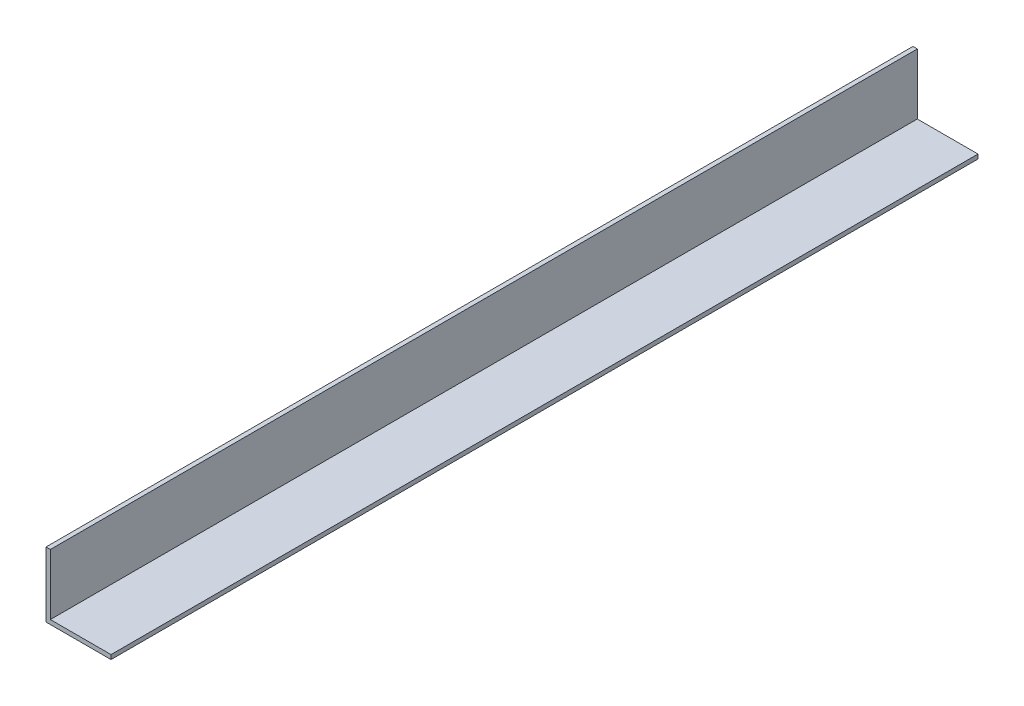
ISO-10303-21;
HEADER;
FILE_DESCRIPTION(('STEP AP214'),'2;1');
FILE_NAME('part.step','',(''),(''),'','','');
FILE_SCHEMA(('AUTOMOTIVE_DESIGN { 1 0 10303 214 1 1 1 1 }'));
ENDSEC;
DATA;
#1=APPLICATION_CONTEXT('core data for automotive mechanical design processes');
#2=APPLICATION_PROTOCOL_DEFINITION('international standard','automotive_design',2000,#1);
#3=PRODUCT_CONTEXT('',#1,'mechanical');
#4=PRODUCT('Part','Part','',(#3));
#5=PRODUCT_RELATED_PRODUCT_CATEGORY('part','',(#4));
#6=PRODUCT_DEFINITION_FORMATION('','',#4);
#7=PRODUCT_DEFINITION_CONTEXT('part definition',#1,'design');
#8=PRODUCT_DEFINITION('design','',#6,#7);
#9=PRODUCT_DEFINITION_SHAPE('','',#8);
#10=(LENGTH_UNIT() NAMED_UNIT(*) SI_UNIT(.MILLI.,.METRE.));
#11=(NAMED_UNIT(*) PLANE_ANGLE_UNIT() SI_UNIT($,.RADIAN.));
#12=(NAMED_UNIT(*) SI_UNIT($,.STERADIAN.) SOLID_ANGLE_UNIT());
#13=UNCERTAINTY_MEASURE_WITH_UNIT(LENGTH_MEASURE(1.E-05),#10,'distance_accuracy_value','');
#14=(GEOMETRIC_REPRESENTATION_CONTEXT(3) GLOBAL_UNCERTAINTY_ASSIGNED_CONTEXT((#13)) GLOBAL_UNIT_ASSIGNED_CONTEXT((#10,
#11,#12)) REPRESENTATION_CONTEXT('',''));
#15=CARTESIAN_POINT('',(0.,0.,0.));
#16=DIRECTION('',(0.,0.,1.));
#17=DIRECTION('',(1.,0.,0.));
#18=AXIS2_PLACEMENT_3D('',#15,#16,#17);
#19=CARTESIAN_POINT('',(30.,5.60231842899837,400.));
#20=DIRECTION('',(0.,1.,0.));
#21=DIRECTION('',(-1.,0.,0.));
#22=AXIS2_PLACEMENT_3D('',#19,#20,#21);
#23=PLANE('',#22);
#24=DIRECTION('',(1.,0.,0.));
#25=VECTOR('',#24,1.);
#26=CARTESIAN_POINT('',(30.,5.60231842899837,0.));
#27=LINE('',#26,#25);
#28=CARTESIAN_POINT('',(0.,5.60231842899837,0.));
#29=VERTEX_POINT('',#28);
#30=CARTESIAN_POINT('',(30.,5.60231842899837,0.));
#31=VERTEX_POINT('',#30);
#32=EDGE_CURVE('E117',#29,#31,#27,.T.);
#33=ORIENTED_EDGE('',*,*,#32,.T.);
#34=DIRECTION('',(0.,0.,-1.));
#35=VECTOR('',#34,1.);
#36=CARTESIAN_POINT('',(30.,5.60231842899837,400.));
#37=LINE('',#36,#35);
#38=CARTESIAN_POINT('',(30.,5.60231842899837,400.));
#39=VERTEX_POINT('',#38);
#40=EDGE_CURVE('E11',#39,#31,#37,.T.);
#41=ORIENTED_EDGE('',*,*,#40,.F.);
#42=DIRECTION('',(1.,0.,0.));
#43=VECTOR('',#42,1.);
#44=CARTESIAN_POINT('',(30.,5.60231842899837,400.));
#45=LINE('',#44,#43);
#46=CARTESIAN_POINT('',(0.,5.60231842899837,400.));
#47=VERTEX_POINT('',#46);
#48=EDGE_CURVE('E127',#47,#39,#45,.T.);
#49=ORIENTED_EDGE('',*,*,#48,.F.);
#50=DIRECTION('',(0.,0.,-1.));
#51=VECTOR('',#50,1.);
#52=CARTESIAN_POINT('',(0.,5.60231842899837,400.));
#53=LINE('',#52,#51);
#54=EDGE_CURVE('E113',#47,#29,#53,.T.);
#55=ORIENTED_EDGE('',*,*,#54,.T.);
#56=EDGE_LOOP('',(#33,#41,#49,#55));
#57=FACE_BOUND('',#56,.T.);
#58=ADVANCED_FACE('F33',(#57),#23,.F.);
#59=CARTESIAN_POINT('',(30.,7.60231842899837,400.));
#60=DIRECTION('',(-1.,0.,0.));
#61=DIRECTION('',(0.,0.,1.));
#62=AXIS2_PLACEMENT_3D('',#59,#60,#61);
#63=PLANE('',#62);
#64=DIRECTION('',(0.,1.,0.));
#65=VECTOR('',#64,1.);
#66=CARTESIAN_POINT('',(30.,7.60231842899837,0.));
#67=LINE('',#66,#65);
#68=CARTESIAN_POINT('',(30.,7.60231842899837,0.));
#69=VERTEX_POINT('',#68);
#70=EDGE_CURVE('E120',#31,#69,#67,.T.);
#71=ORIENTED_EDGE('',*,*,#70,.T.);
#72=DIRECTION('',(0.,0.,-1.));
#73=VECTOR('',#72,1.);
#74=CARTESIAN_POINT('',(30.,7.60231842899837,400.));
#75=LINE('',#74,#73);
#76=CARTESIAN_POINT('',(30.,7.60231842899837,400.));
#77=VERTEX_POINT('',#76);
#78=EDGE_CURVE('E41',#77,#69,#75,.T.);
#79=ORIENTED_EDGE('',*,*,#78,.F.);
#80=DIRECTION('',(0.,1.,0.));
#81=VECTOR('',#80,1.);
#82=CARTESIAN_POINT('',(30.,7.60231842899837,400.));
#83=LINE('',#82,#81);
#84=EDGE_CURVE('E86',#39,#77,#83,.T.);
#85=ORIENTED_EDGE('',*,*,#84,.F.);
#86=ORIENTED_EDGE('',*,*,#40,.T.);
#87=EDGE_LOOP('',(#71,#79,#85,#86));
#88=FACE_BOUND('',#87,.T.);
#89=ADVANCED_FACE('F151',(#88),#63,.F.);
#90=CARTESIAN_POINT('',(2.,7.60231842899837,400.));
#91=DIRECTION('',(0.,-1.,0.));
#92=DIRECTION('',(0.,0.,-1.));
#93=AXIS2_PLACEMENT_3D('',#90,#91,#92);
#94=PLANE('',#93);
#95=DIRECTION('',(-1.,0.,0.));
#96=VECTOR('',#95,1.);
#97=CARTESIAN_POINT('',(2.,7.60231842899837,0.));
#98=LINE('',#97,#96);
#99=CARTESIAN_POINT('',(2.,7.60231842899837,0.));
#100=VERTEX_POINT('',#99);
#101=EDGE_CURVE('E122',#69,#100,#98,.T.);
#102=ORIENTED_EDGE('',*,*,#101,.T.);
#103=DIRECTION('',(0.,0.,-1.));
#104=VECTOR('',#103,1.);
#105=CARTESIAN_POINT('',(2.,7.60231842899837,400.));
#106=LINE('',#105,#104);
#107=CARTESIAN_POINT('',(2.,7.60231842899837,400.));
#108=VERTEX_POINT('',#107);
#109=EDGE_CURVE('E108',#108,#100,#106,.T.);
#110=ORIENTED_EDGE('',*,*,#109,.F.);
#111=DIRECTION('',(-1.,0.,0.));
#112=VECTOR('',#111,1.);
#113=CARTESIAN_POINT('',(2.,7.60231842899837,400.));
#114=LINE('',#113,#112);
#115=EDGE_CURVE('E99',#77,#108,#114,.T.);
#116=ORIENTED_EDGE('',*,*,#115,.F.);
#117=ORIENTED_EDGE('',*,*,#78,.T.);
#118=EDGE_LOOP('',(#102,#110,#116,#117));
#119=FACE_BOUND('',#118,.T.);
#120=ADVANCED_FACE('F133',(#119),#94,.F.);
#121=CARTESIAN_POINT('',(2.,35.6023184289984,400.));
#122=DIRECTION('',(-1.,0.,0.));
#123=DIRECTION('',(0.,-1.,0.));
#124=AXIS2_PLACEMENT_3D('',#121,#122,#123);
#125=PLANE('',#124);
#126=DIRECTION('',(0.,1.,0.));
#127=VECTOR('',#126,1.);
#128=CARTESIAN_POINT('',(2.,35.6023184289984,0.));
#129=LINE('',#128,#127);
#130=CARTESIAN_POINT('',(2.,35.6023184289984,0.));
#131=VERTEX_POINT('',#130);
#132=EDGE_CURVE('E107',#100,#131,#129,.T.);
#133=ORIENTED_EDGE('',*,*,#132,.T.);
#134=DIRECTION('',(0.,0.,-1.));
#135=VECTOR('',#134,1.);
#136=CARTESIAN_POINT('',(2.,35.6023184289984,400.));
#137=LINE('',#136,#135);
#138=CARTESIAN_POINT('',(2.,35.6023184289984,400.));
#139=VERTEX_POINT('',#138);
#140=EDGE_CURVE('E104',#139,#131,#137,.T.);
#141=ORIENTED_EDGE('',*,*,#140,.F.);
#142=DIRECTION('',(0.,1.,0.));
#143=VECTOR('',#142,1.);
#144=CARTESIAN_POINT('',(2.,35.6023184289984,400.));
#145=LINE('',#144,#143);
#146=EDGE_CURVE('E93',#108,#139,#145,.T.);
#147=ORIENTED_EDGE('',*,*,#146,.F.);
#148=ORIENTED_EDGE('',*,*,#109,.T.);
#149=EDGE_LOOP('',(#133,#141,#147,#148));
#150=FACE_BOUND('',#149,.T.);
#151=ADVANCED_FACE('F105',(#150),#125,.F.);
#152=CARTESIAN_POINT('',(0.,35.6023184289984,400.));
#153=DIRECTION('',(0.,-1.,0.));
#154=DIRECTION('',(0.,0.,-1.));
#155=AXIS2_PLACEMENT_3D('',#152,#153,#154);
#156=PLANE('',#155);
#157=DIRECTION('',(-1.,0.,0.));
#158=VECTOR('',#157,1.);
#159=CARTESIAN_POINT('',(0.,35.6023184289984,0.));
#160=LINE('',#159,#158);
#161=CARTESIAN_POINT('',(0.,35.6023184289984,0.));
#162=VERTEX_POINT('',#161);
#163=EDGE_CURVE('E72',#131,#162,#160,.T.);
#164=ORIENTED_EDGE('',*,*,#163,.T.);
#165=DIRECTION('',(0.,0.,-1.));
#166=VECTOR('',#165,1.);
#167=CARTESIAN_POINT('',(0.,35.6023184289984,400.));
#168=LINE('',#167,#166);
#169=CARTESIAN_POINT('',(0.,35.6023184289984,400.));
#170=VERTEX_POINT('',#169);
#171=EDGE_CURVE('E109',#170,#162,#168,.T.);
#172=ORIENTED_EDGE('',*,*,#171,.F.);
#173=DIRECTION('',(-1.,0.,0.));
#174=VECTOR('',#173,1.);
#175=CARTESIAN_POINT('',(0.,35.6023184289984,400.));
#176=LINE('',#175,#174);
#177=EDGE_CURVE('E97',#139,#170,#176,.T.);
#178=ORIENTED_EDGE('',*,*,#177,.F.);
#179=ORIENTED_EDGE('',*,*,#140,.T.);
#180=EDGE_LOOP('',(#164,#172,#178,#179));
#181=FACE_BOUND('',#180,.T.);
#182=ADVANCED_FACE('F111',(#181),#156,.F.);
#183=CARTESIAN_POINT('',(0.,5.60231842899837,400.));
#184=DIRECTION('',(1.,0.,0.));
#185=DIRECTION('',(0.,0.,-1.));
#186=AXIS2_PLACEMENT_3D('',#183,#184,#185);
#187=PLANE('',#186);
#188=DIRECTION('',(0.,-1.,0.));
#189=VECTOR('',#188,1.);
#190=CARTESIAN_POINT('',(0.,5.60231842899837,0.));
#191=LINE('',#190,#189);
#192=EDGE_CURVE('E78',#162,#29,#191,.T.);
#193=ORIENTED_EDGE('',*,*,#192,.T.);
#194=ORIENTED_EDGE('',*,*,#54,.F.);
#195=DIRECTION('',(0.,-1.,0.));
#196=VECTOR('',#195,1.);
#197=CARTESIAN_POINT('',(0.,5.60231842899837,400.));
#198=LINE('',#197,#196);
#199=EDGE_CURVE('E49',#170,#47,#198,.T.);
#200=ORIENTED_EDGE('',*,*,#199,.F.);
#201=ORIENTED_EDGE('',*,*,#171,.T.);
#202=EDGE_LOOP('',(#193,#194,#200,#201));
#203=FACE_BOUND('',#202,.T.);
#204=ADVANCED_FACE('F140',(#203),#187,.F.);
#205=CARTESIAN_POINT('',(0.,0.,400.));
#206=DIRECTION('',(0.,0.,-1.));
#207=DIRECTION('',(-1.,0.,0.));
#208=AXIS2_PLACEMENT_3D('',#205,#206,#207);
#209=PLANE('',#208);
#210=ORIENTED_EDGE('',*,*,#48,.T.);
#211=ORIENTED_EDGE('',*,*,#84,.T.);
#212=ORIENTED_EDGE('',*,*,#115,.T.);
#213=ORIENTED_EDGE('',*,*,#146,.T.);
#214=ORIENTED_EDGE('',*,*,#177,.T.);
#215=ORIENTED_EDGE('',*,*,#199,.T.);
#216=EDGE_LOOP('',(#210,#211,#212,#213,#214,#215));
#217=FACE_BOUND('',#216,.T.);
#218=ADVANCED_FACE('F95',(#217),#209,.F.);
#219=CARTESIAN_POINT('',(0.,0.,0.));
#220=DIRECTION('',(0.,0.,-1.));
#221=DIRECTION('',(-1.,0.,0.));
#222=AXIS2_PLACEMENT_3D('',#219,#220,#221);
#223=PLANE('',#222);
#224=ORIENTED_EDGE('',*,*,#32,.F.);
#225=ORIENTED_EDGE('',*,*,#192,.F.);
#226=ORIENTED_EDGE('',*,*,#163,.F.);
#227=ORIENTED_EDGE('',*,*,#132,.F.);
#228=ORIENTED_EDGE('',*,*,#101,.F.);
#229=ORIENTED_EDGE('',*,*,#70,.F.);
#230=EDGE_LOOP('',(#224,#225,#226,#227,#228,#229));
#231=FACE_BOUND('',#230,.T.);
#232=ADVANCED_FACE('F136',(#231),#223,.T.);
#233=CLOSED_SHELL('',(#58,#89,#120,#151,#182,#204,#218,#232));
#234=MANIFOLD_SOLID_BREP('B2',#233);
#235=ADVANCED_BREP_SHAPE_REPRESENTATION('',(#18,#234),#14);
#236=SHAPE_DEFINITION_REPRESENTATION(#9,#235);
ENDSEC;
END-ISO-10303-21;
